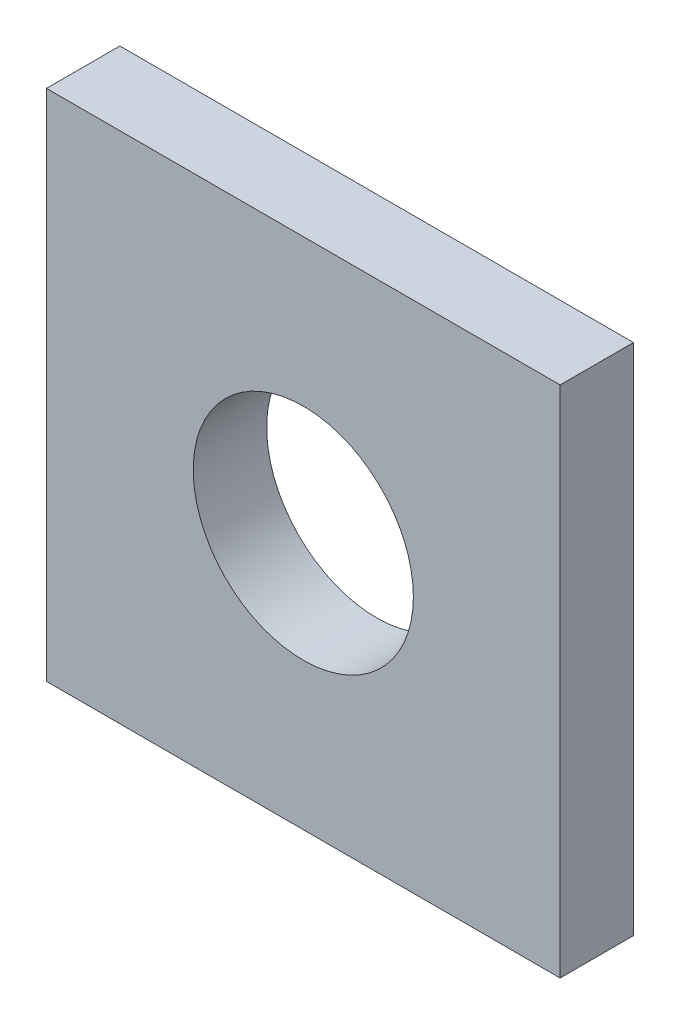
ISO-10303-21;
HEADER;
FILE_DESCRIPTION(('STEP AP214'),'2;1');
FILE_NAME('part.step','',(''),(''),'','','');
FILE_SCHEMA(('AUTOMOTIVE_DESIGN { 1 0 10303 214 1 1 1 1 }'));
ENDSEC;
DATA;
#1=APPLICATION_CONTEXT('core data for automotive mechanical design processes');
#2=APPLICATION_PROTOCOL_DEFINITION('international standard','automotive_design',2000,#1);
#3=PRODUCT_CONTEXT('',#1,'mechanical');
#4=PRODUCT('Part','Part','',(#3));
#5=PRODUCT_RELATED_PRODUCT_CATEGORY('part','',(#4));
#6=PRODUCT_DEFINITION_FORMATION('','',#4);
#7=PRODUCT_DEFINITION_CONTEXT('part definition',#1,'design');
#8=PRODUCT_DEFINITION('design','',#6,#7);
#9=PRODUCT_DEFINITION_SHAPE('','',#8);
#10=(LENGTH_UNIT() NAMED_UNIT(*) SI_UNIT(.MILLI.,.METRE.));
#11=(NAMED_UNIT(*) PLANE_ANGLE_UNIT() SI_UNIT($,.RADIAN.));
#12=(NAMED_UNIT(*) SI_UNIT($,.STERADIAN.) SOLID_ANGLE_UNIT());
#13=UNCERTAINTY_MEASURE_WITH_UNIT(LENGTH_MEASURE(1.E-05),#10,'distance_accuracy_value','');
#14=(GEOMETRIC_REPRESENTATION_CONTEXT(3) GLOBAL_UNCERTAINTY_ASSIGNED_CONTEXT((#13)) GLOBAL_UNIT_ASSIGNED_CONTEXT((#10,
#11,#12)) REPRESENTATION_CONTEXT('',''));
#15=CARTESIAN_POINT('',(0.,0.,0.));
#16=DIRECTION('',(0.,0.,1.));
#17=DIRECTION('',(1.,0.,0.));
#18=AXIS2_PLACEMENT_3D('',#15,#16,#17);
#19=CARTESIAN_POINT('',(0.,0.,6.));
#20=DIRECTION('',(0.,0.,-1.));
#21=DIRECTION('',(-1.,0.,0.));
#22=AXIS2_PLACEMENT_3D('',#19,#20,#21);
#23=PLANE('',#22);
#24=DIRECTION('',(0.,1.,0.));
#25=VECTOR('',#24,1.);
#26=CARTESIAN_POINT('',(21.,-21.,6.));
#27=LINE('',#26,#25);
#28=CARTESIAN_POINT('',(21.,-21.,6.));
#29=VERTEX_POINT('',#28);
#30=CARTESIAN_POINT('',(21.,21.,6.));
#31=VERTEX_POINT('',#30);
#32=EDGE_CURVE('E100',#29,#31,#27,.T.);
#33=ORIENTED_EDGE('',*,*,#32,.T.);
#34=DIRECTION('',(-1.,0.,0.));
#35=VECTOR('',#34,1.);
#36=CARTESIAN_POINT('',(-21.,21.,6.));
#37=LINE('',#36,#35);
#38=CARTESIAN_POINT('',(-21.,21.,6.));
#39=VERTEX_POINT('',#38);
#40=EDGE_CURVE('E95',#31,#39,#37,.T.);
#41=ORIENTED_EDGE('',*,*,#40,.T.);
#42=DIRECTION('',(0.,-1.,0.));
#43=VECTOR('',#42,1.);
#44=CARTESIAN_POINT('',(-21.,-21.,6.));
#45=LINE('',#44,#43);
#46=CARTESIAN_POINT('',(-21.,-21.,6.));
#47=VERTEX_POINT('',#46);
#48=EDGE_CURVE('E92',#39,#47,#45,.T.);
#49=ORIENTED_EDGE('',*,*,#48,.T.);
#50=DIRECTION('',(1.,0.,0.));
#51=VECTOR('',#50,1.);
#52=CARTESIAN_POINT('',(-21.,-21.,6.));
#53=LINE('',#52,#51);
#54=EDGE_CURVE('E64',#47,#29,#53,.T.);
#55=ORIENTED_EDGE('',*,*,#54,.T.);
#56=EDGE_LOOP('',(#33,#41,#49,#55));
#57=FACE_BOUND('',#56,.T.);
#58=CARTESIAN_POINT('',(0.,0.,6.));
#59=DIRECTION('',(0.,0.,1.));
#60=DIRECTION('',(1.,0.,0.));
#61=AXIS2_PLACEMENT_3D('',#58,#59,#60);
#62=CIRCLE('',#61,9.);
#63=CARTESIAN_POINT('',(9.,0.,6.));
#64=VERTEX_POINT('',#63);
#65=EDGE_CURVE('E115',#64,#64,#62,.T.);
#66=ORIENTED_EDGE('',*,*,#65,.F.);
#67=EDGE_LOOP('',(#66));
#68=FACE_BOUND('',#67,.T.);
#69=ADVANCED_FACE('F44',(#57,#68),#23,.F.);
#70=CARTESIAN_POINT('',(0.,0.,0.));
#71=DIRECTION('',(0.,0.,-1.));
#72=DIRECTION('',(-1.,0.,0.));
#73=AXIS2_PLACEMENT_3D('',#70,#71,#72);
#74=PLANE('',#73);
#75=DIRECTION('',(0.,1.,0.));
#76=VECTOR('',#75,1.);
#77=CARTESIAN_POINT('',(21.,-21.,0.));
#78=LINE('',#77,#76);
#79=CARTESIAN_POINT('',(21.,-21.,0.));
#80=VERTEX_POINT('',#79);
#81=CARTESIAN_POINT('',(21.,21.,0.));
#82=VERTEX_POINT('',#81);
#83=EDGE_CURVE('E108',#80,#82,#78,.T.);
#84=ORIENTED_EDGE('',*,*,#83,.F.);
#85=DIRECTION('',(1.,0.,0.));
#86=VECTOR('',#85,1.);
#87=CARTESIAN_POINT('',(-21.,-21.,0.));
#88=LINE('',#87,#86);
#89=CARTESIAN_POINT('',(-21.,-21.,0.));
#90=VERTEX_POINT('',#89);
#91=EDGE_CURVE('E84',#90,#80,#88,.T.);
#92=ORIENTED_EDGE('',*,*,#91,.F.);
#93=DIRECTION('',(0.,-1.,0.));
#94=VECTOR('',#93,1.);
#95=CARTESIAN_POINT('',(-21.,-21.,0.));
#96=LINE('',#95,#94);
#97=CARTESIAN_POINT('',(-21.,21.,0.));
#98=VERTEX_POINT('',#97);
#99=EDGE_CURVE('E80',#98,#90,#96,.T.);
#100=ORIENTED_EDGE('',*,*,#99,.F.);
#101=DIRECTION('',(-1.,0.,0.));
#102=VECTOR('',#101,1.);
#103=CARTESIAN_POINT('',(-21.,21.,0.));
#104=LINE('',#103,#102);
#105=EDGE_CURVE('E101',#82,#98,#104,.T.);
#106=ORIENTED_EDGE('',*,*,#105,.F.);
#107=EDGE_LOOP('',(#84,#92,#100,#106));
#108=FACE_BOUND('',#107,.T.);
#109=CARTESIAN_POINT('',(0.,0.,0.));
#110=DIRECTION('',(0.,0.,1.));
#111=DIRECTION('',(1.,0.,0.));
#112=AXIS2_PLACEMENT_3D('',#109,#110,#111);
#113=CIRCLE('',#112,9.);
#114=CARTESIAN_POINT('',(9.,0.,0.));
#115=VERTEX_POINT('',#114);
#116=EDGE_CURVE('E122',#115,#115,#113,.T.);
#117=ORIENTED_EDGE('',*,*,#116,.T.);
#118=EDGE_LOOP('',(#117));
#119=FACE_BOUND('',#118,.T.);
#120=ADVANCED_FACE('F116',(#108,#119),#74,.T.);
#121=CARTESIAN_POINT('',(21.,-21.,6.));
#122=DIRECTION('',(-1.,0.,0.));
#123=DIRECTION('',(0.,0.,1.));
#124=AXIS2_PLACEMENT_3D('',#121,#122,#123);
#125=PLANE('',#124);
#126=ORIENTED_EDGE('',*,*,#83,.T.);
#127=DIRECTION('',(0.,0.,-1.));
#128=VECTOR('',#127,1.);
#129=CARTESIAN_POINT('',(21.,21.,6.));
#130=LINE('',#129,#128);
#131=EDGE_CURVE('E11',#31,#82,#130,.T.);
#132=ORIENTED_EDGE('',*,*,#131,.F.);
#133=ORIENTED_EDGE('',*,*,#32,.F.);
#134=DIRECTION('',(0.,0.,-1.));
#135=VECTOR('',#134,1.);
#136=CARTESIAN_POINT('',(21.,-21.,6.));
#137=LINE('',#136,#135);
#138=EDGE_CURVE('E104',#29,#80,#137,.T.);
#139=ORIENTED_EDGE('',*,*,#138,.T.);
#140=EDGE_LOOP('',(#126,#132,#133,#139));
#141=FACE_BOUND('',#140,.T.);
#142=ADVANCED_FACE('F50',(#141),#125,.F.);
#143=CARTESIAN_POINT('',(-21.,21.,6.));
#144=DIRECTION('',(0.,-1.,0.));
#145=DIRECTION('',(0.,0.,-1.));
#146=AXIS2_PLACEMENT_3D('',#143,#144,#145);
#147=PLANE('',#146);
#148=ORIENTED_EDGE('',*,*,#105,.T.);
#149=DIRECTION('',(0.,0.,-1.));
#150=VECTOR('',#149,1.);
#151=CARTESIAN_POINT('',(-21.,21.,6.));
#152=LINE('',#151,#150);
#153=EDGE_CURVE('E53',#39,#98,#152,.T.);
#154=ORIENTED_EDGE('',*,*,#153,.F.);
#155=ORIENTED_EDGE('',*,*,#40,.F.);
#156=ORIENTED_EDGE('',*,*,#131,.T.);
#157=EDGE_LOOP('',(#148,#154,#155,#156));
#158=FACE_BOUND('',#157,.T.);
#159=ADVANCED_FACE('F99',(#158),#147,.F.);
#160=CARTESIAN_POINT('',(-21.,-21.,6.));
#161=DIRECTION('',(1.,0.,0.));
#162=DIRECTION('',(0.,0.,-1.));
#163=AXIS2_PLACEMENT_3D('',#160,#161,#162);
#164=PLANE('',#163);
#165=ORIENTED_EDGE('',*,*,#99,.T.);
#166=DIRECTION('',(0.,0.,-1.));
#167=VECTOR('',#166,1.);
#168=CARTESIAN_POINT('',(-21.,-21.,6.));
#169=LINE('',#168,#167);
#170=EDGE_CURVE('E105',#47,#90,#169,.T.);
#171=ORIENTED_EDGE('',*,*,#170,.F.);
#172=ORIENTED_EDGE('',*,*,#48,.F.);
#173=ORIENTED_EDGE('',*,*,#153,.T.);
#174=EDGE_LOOP('',(#165,#171,#172,#173));
#175=FACE_BOUND('',#174,.T.);
#176=ADVANCED_FACE('F103',(#175),#164,.F.);
#177=CARTESIAN_POINT('',(-21.,-21.,6.));
#178=DIRECTION('',(0.,1.,0.));
#179=DIRECTION('',(0.,0.,1.));
#180=AXIS2_PLACEMENT_3D('',#177,#178,#179);
#181=PLANE('',#180);
#182=ORIENTED_EDGE('',*,*,#91,.T.);
#183=ORIENTED_EDGE('',*,*,#138,.F.);
#184=ORIENTED_EDGE('',*,*,#54,.F.);
#185=ORIENTED_EDGE('',*,*,#170,.T.);
#186=EDGE_LOOP('',(#182,#183,#184,#185));
#187=FACE_BOUND('',#186,.T.);
#188=ADVANCED_FACE('F119',(#187),#181,.F.);
#189=CARTESIAN_POINT('',(0.,0.,6.));
#190=DIRECTION('',(0.,0.,-1.));
#191=DIRECTION('',(-1.,0.,0.));
#192=AXIS2_PLACEMENT_3D('',#189,#190,#191);
#193=CYLINDRICAL_SURFACE('',#192,9.);
#194=ORIENTED_EDGE('',*,*,#65,.T.);
#195=EDGE_LOOP('',(#194));
#196=FACE_BOUND('',#195,.T.);
#197=ORIENTED_EDGE('',*,*,#116,.F.);
#198=EDGE_LOOP('',(#197));
#199=FACE_BOUND('',#198,.T.);
#200=ADVANCED_FACE('F128',(#196,#199),#193,.F.);
#201=CLOSED_SHELL('',(#69,#120,#142,#159,#176,#188,#200));
#202=MANIFOLD_SOLID_BREP('B2',#201);
#203=ADVANCED_BREP_SHAPE_REPRESENTATION('',(#18,#202),#14);
#204=SHAPE_DEFINITION_REPRESENTATION(#9,#203);
ENDSEC;
END-ISO-10303-21;
